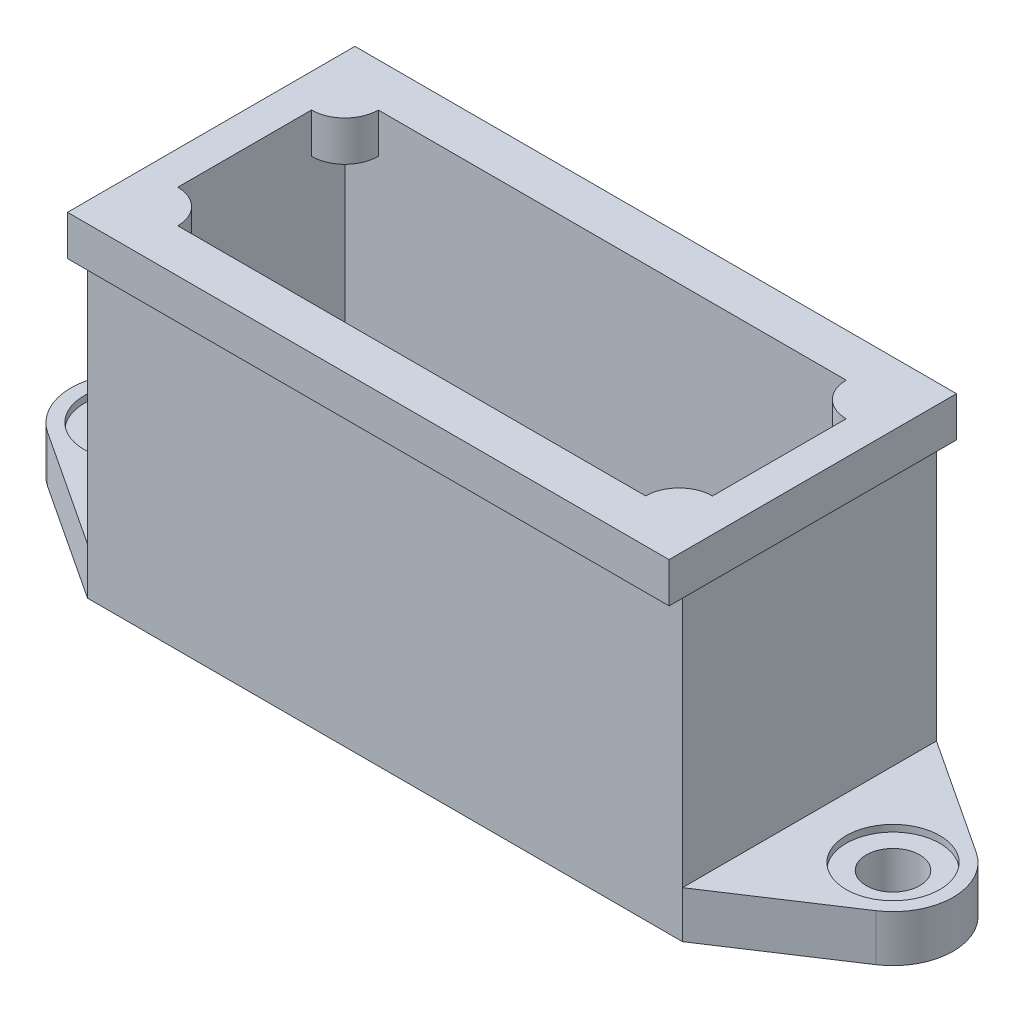
ISO-10303-21;
HEADER;
FILE_DESCRIPTION(('STEP AP214'),'2;1');
FILE_NAME('part.step','',(''),(''),'','','');
FILE_SCHEMA(('AUTOMOTIVE_DESIGN { 1 0 10303 214 1 1 1 1 }'));
ENDSEC;
DATA;
#1=APPLICATION_CONTEXT('core data for automotive mechanical design processes');
#2=APPLICATION_PROTOCOL_DEFINITION('international standard','automotive_design',2000,#1);
#3=PRODUCT_CONTEXT('',#1,'mechanical');
#4=PRODUCT('Part','Part','',(#3));
#5=PRODUCT_RELATED_PRODUCT_CATEGORY('part','',(#4));
#6=PRODUCT_DEFINITION_FORMATION('','',#4);
#7=PRODUCT_DEFINITION_CONTEXT('part definition',#1,'design');
#8=PRODUCT_DEFINITION('design','',#6,#7);
#9=PRODUCT_DEFINITION_SHAPE('','',#8);
#10=(LENGTH_UNIT() NAMED_UNIT(*) SI_UNIT(.MILLI.,.METRE.));
#11=(NAMED_UNIT(*) PLANE_ANGLE_UNIT() SI_UNIT($,.RADIAN.));
#12=(NAMED_UNIT(*) SI_UNIT($,.STERADIAN.) SOLID_ANGLE_UNIT());
#13=UNCERTAINTY_MEASURE_WITH_UNIT(LENGTH_MEASURE(1.E-05),#10,'distance_accuracy_value','');
#14=(GEOMETRIC_REPRESENTATION_CONTEXT(3) GLOBAL_UNCERTAINTY_ASSIGNED_CONTEXT((#13)) GLOBAL_UNIT_ASSIGNED_CONTEXT((#10,
#11,#12)) REPRESENTATION_CONTEXT('',''));
#15=CARTESIAN_POINT('',(0.,0.,0.));
#16=DIRECTION('',(0.,0.,1.));
#17=DIRECTION('',(1.,0.,0.));
#18=AXIS2_PLACEMENT_3D('',#15,#16,#17);
#19=CARTESIAN_POINT('',(89.,90.,38.));
#20=DIRECTION('',(-1.,0.,0.));
#21=DIRECTION('',(0.,0.,1.));
#22=AXIS2_PLACEMENT_3D('',#19,#20,#21);
#23=PLANE('',#22);
#24=DIRECTION('',(0.,0.,1.));
#25=VECTOR('',#24,1.);
#26=CARTESIAN_POINT('',(89.,14.,-38.));
#27=LINE('',#26,#25);
#28=CARTESIAN_POINT('',(89.,14.,-38.));
#29=VERTEX_POINT('',#28);
#30=CARTESIAN_POINT('',(89.,14.,38.));
#31=VERTEX_POINT('',#30);
#32=EDGE_CURVE('E57',#29,#31,#27,.T.);
#33=ORIENTED_EDGE('',*,*,#32,.F.);
#34=DIRECTION('',(0.,-1.,0.));
#35=VECTOR('',#34,1.);
#36=CARTESIAN_POINT('',(89.,90.,-38.));
#37=LINE('',#36,#35);
#38=CARTESIAN_POINT('',(89.,90.,-38.));
#39=VERTEX_POINT('',#38);
#40=EDGE_CURVE('E11',#39,#29,#37,.T.);
#41=ORIENTED_EDGE('',*,*,#40,.F.);
#42=DIRECTION('',(0.,0.,-1.));
#43=VECTOR('',#42,1.);
#44=CARTESIAN_POINT('',(89.,90.,38.));
#45=LINE('',#44,#43);
#46=CARTESIAN_POINT('',(89.,90.,38.));
#47=VERTEX_POINT('',#46);
#48=EDGE_CURVE('E363',#47,#39,#45,.T.);
#49=ORIENTED_EDGE('',*,*,#48,.F.);
#50=DIRECTION('',(0.,-1.,0.));
#51=VECTOR('',#50,1.);
#52=CARTESIAN_POINT('',(89.,90.,38.));
#53=LINE('',#52,#51);
#54=EDGE_CURVE('E376',#47,#31,#53,.T.);
#55=ORIENTED_EDGE('',*,*,#54,.T.);
#56=EDGE_LOOP('',(#33,#41,#49,#55));
#57=FACE_BOUND('',#56,.T.);
#58=ADVANCED_FACE('F35',(#57),#23,.F.);
#59=CARTESIAN_POINT('',(-89.,90.,-38.));
#60=DIRECTION('',(0.,0.,1.));
#61=DIRECTION('',(1.,0.,0.));
#62=AXIS2_PLACEMENT_3D('',#59,#60,#61);
#63=PLANE('',#62);
#64=DIRECTION('',(-1.,0.,0.));
#65=VECTOR('',#64,1.);
#66=CARTESIAN_POINT('',(-89.,0.,-38.));
#67=LINE('',#66,#65);
#68=CARTESIAN_POINT('',(89.,0.,-38.));
#69=VERTEX_POINT('',#68);
#70=CARTESIAN_POINT('',(-89.,0.,-38.));
#71=VERTEX_POINT('',#70);
#72=EDGE_CURVE('E362',#69,#71,#67,.T.);
#73=ORIENTED_EDGE('',*,*,#72,.T.);
#74=DIRECTION('',(0.,-1.,0.));
#75=VECTOR('',#74,1.);
#76=CARTESIAN_POINT('',(-89.,14.,-38.));
#77=LINE('',#76,#75);
#78=CARTESIAN_POINT('',(-89.,14.,-38.));
#79=VERTEX_POINT('',#78);
#80=EDGE_CURVE('E315',#79,#71,#77,.T.);
#81=ORIENTED_EDGE('',*,*,#80,.F.);
#82=DIRECTION('',(0.,-1.,0.));
#83=VECTOR('',#82,1.);
#84=CARTESIAN_POINT('',(-89.,90.,-38.));
#85=LINE('',#84,#83);
#86=CARTESIAN_POINT('',(-89.,90.,-38.));
#87=VERTEX_POINT('',#86);
#88=EDGE_CURVE('E42',#87,#79,#85,.T.);
#89=ORIENTED_EDGE('',*,*,#88,.F.);
#90=DIRECTION('',(-1.,0.,0.));
#91=VECTOR('',#90,1.);
#92=CARTESIAN_POINT('',(-89.,90.,-38.));
#93=LINE('',#92,#91);
#94=EDGE_CURVE('E366',#39,#87,#93,.T.);
#95=ORIENTED_EDGE('',*,*,#94,.F.);
#96=ORIENTED_EDGE('',*,*,#40,.T.);
#97=DIRECTION('',(0.,-1.,0.));
#98=VECTOR('',#97,1.);
#99=CARTESIAN_POINT('',(89.,14.,-38.));
#100=LINE('',#99,#98);
#101=EDGE_CURVE('E357',#29,#69,#100,.T.);
#102=ORIENTED_EDGE('',*,*,#101,.T.);
#103=EDGE_LOOP('',(#73,#81,#89,#95,#96,#102));
#104=FACE_BOUND('',#103,.T.);
#105=ADVANCED_FACE('F389',(#104),#63,.F.);
#106=CARTESIAN_POINT('',(-89.,90.,38.));
#107=DIRECTION('',(1.,0.,0.));
#108=DIRECTION('',(0.,0.,-1.));
#109=AXIS2_PLACEMENT_3D('',#106,#107,#108);
#110=PLANE('',#109);
#111=ORIENTED_EDGE('',*,*,#88,.T.);
#112=DIRECTION('',(0.,0.,1.));
#113=VECTOR('',#112,1.);
#114=CARTESIAN_POINT('',(-89.,14.,-38.));
#115=LINE('',#114,#113);
#116=CARTESIAN_POINT('',(-89.,14.,38.));
#117=VERTEX_POINT('',#116);
#118=EDGE_CURVE('E300',#79,#117,#115,.T.);
#119=ORIENTED_EDGE('',*,*,#118,.T.);
#120=DIRECTION('',(0.,-1.,0.));
#121=VECTOR('',#120,1.);
#122=CARTESIAN_POINT('',(-89.,90.,38.));
#123=LINE('',#122,#121);
#124=CARTESIAN_POINT('',(-89.,90.,38.));
#125=VERTEX_POINT('',#124);
#126=EDGE_CURVE('E381',#125,#117,#123,.T.);
#127=ORIENTED_EDGE('',*,*,#126,.F.);
#128=DIRECTION('',(0.,0.,1.));
#129=VECTOR('',#128,1.);
#130=CARTESIAN_POINT('',(-89.,90.,38.));
#131=LINE('',#130,#129);
#132=EDGE_CURVE('E370',#87,#125,#131,.T.);
#133=ORIENTED_EDGE('',*,*,#132,.F.);
#134=EDGE_LOOP('',(#111,#119,#127,#133));
#135=FACE_BOUND('',#134,.T.);
#136=ADVANCED_FACE('F386',(#135),#110,.F.);
#137=CARTESIAN_POINT('',(-89.,90.,38.));
#138=DIRECTION('',(0.,0.,-1.));
#139=DIRECTION('',(-1.,0.,0.));
#140=AXIS2_PLACEMENT_3D('',#137,#138,#139);
#141=PLANE('',#140);
#142=DIRECTION('',(1.,0.,0.));
#143=VECTOR('',#142,1.);
#144=CARTESIAN_POINT('',(-89.,0.,38.));
#145=LINE('',#144,#143);
#146=CARTESIAN_POINT('',(-89.,0.,38.));
#147=VERTEX_POINT('',#146);
#148=CARTESIAN_POINT('',(89.,0.,38.));
#149=VERTEX_POINT('',#148);
#150=EDGE_CURVE('E367',#147,#149,#145,.T.);
#151=ORIENTED_EDGE('',*,*,#150,.T.);
#152=DIRECTION('',(0.,-1.,0.));
#153=VECTOR('',#152,1.);
#154=CARTESIAN_POINT('',(89.,14.,38.));
#155=LINE('',#154,#153);
#156=EDGE_CURVE('E354',#31,#149,#155,.T.);
#157=ORIENTED_EDGE('',*,*,#156,.F.);
#158=ORIENTED_EDGE('',*,*,#54,.F.);
#159=DIRECTION('',(1.,0.,0.));
#160=VECTOR('',#159,1.);
#161=CARTESIAN_POINT('',(-89.,90.,38.));
#162=LINE('',#161,#160);
#163=EDGE_CURVE('E373',#125,#47,#162,.T.);
#164=ORIENTED_EDGE('',*,*,#163,.F.);
#165=ORIENTED_EDGE('',*,*,#126,.T.);
#166=DIRECTION('',(0.,-1.,0.));
#167=VECTOR('',#166,1.);
#168=CARTESIAN_POINT('',(-89.,14.,38.));
#169=LINE('',#168,#167);
#170=EDGE_CURVE('E317',#117,#147,#169,.T.);
#171=ORIENTED_EDGE('',*,*,#170,.T.);
#172=EDGE_LOOP('',(#151,#157,#158,#164,#165,#171));
#173=FACE_BOUND('',#172,.T.);
#174=ADVANCED_FACE('F423',(#173),#141,.F.);
#175=CARTESIAN_POINT('',(0.,0.,0.));
#176=DIRECTION('',(0.,-1.,0.));
#177=DIRECTION('',(0.,0.,-1.));
#178=AXIS2_PLACEMENT_3D('',#175,#176,#177);
#179=PLANE('',#178);
#180=CARTESIAN_POINT('',(-114.,0.,0.));
#181=DIRECTION('',(0.,1.,0.));
#182=DIRECTION('',(0.,0.,1.));
#183=AXIS2_PLACEMENT_3D('',#180,#181,#182);
#184=CIRCLE('',#183,7.99999999999999);
#185=CARTESIAN_POINT('',(-114.,0.,7.99999999999999));
#186=VERTEX_POINT('',#185);
#187=EDGE_CURVE('E291',#186,#186,#184,.T.);
#188=ORIENTED_EDGE('',*,*,#187,.T.);
#189=EDGE_LOOP('',(#188));
#190=FACE_BOUND('',#189,.T.);
#191=CARTESIAN_POINT('',(114.,0.,0.));
#192=DIRECTION('',(0.,1.,0.));
#193=DIRECTION('',(0.,0.,1.));
#194=AXIS2_PLACEMENT_3D('',#191,#192,#193);
#195=CIRCLE('',#194,7.99999999999999);
#196=CARTESIAN_POINT('',(114.,0.,7.99999999999999));
#197=VERTEX_POINT('',#196);
#198=EDGE_CURVE('E331',#197,#197,#195,.T.);
#199=ORIENTED_EDGE('',*,*,#198,.T.);
#200=EDGE_LOOP('',(#199));
#201=FACE_BOUND('',#200,.T.);
#202=ORIENTED_EDGE('',*,*,#72,.F.);
#203=DIRECTION('',(-0.835345543117579,0.,-0.54972522553872));
#204=VECTOR('',#203,1.);
#205=CARTESIAN_POINT('',(123.895054059697,0.,-15.0362197761164));
#206=LINE('',#205,#204);
#207=CARTESIAN_POINT('',(123.895054059697,0.,-15.0362197761164));
#208=VERTEX_POINT('',#207);
#209=EDGE_CURVE('E348',#208,#69,#206,.T.);
#210=ORIENTED_EDGE('',*,*,#209,.F.);
#211=CARTESIAN_POINT('',(114.,0.,0.));
#212=DIRECTION('',(0.,1.,0.));
#213=DIRECTION('',(0.,0.,1.));
#214=AXIS2_PLACEMENT_3D('',#211,#212,#213);
#215=CIRCLE('',#214,18.);
#216=CARTESIAN_POINT('',(123.895054059697,0.,15.0362197761164));
#217=VERTEX_POINT('',#216);
#218=EDGE_CURVE('E334',#217,#208,#215,.T.);
#219=ORIENTED_EDGE('',*,*,#218,.F.);
#220=DIRECTION('',(0.835345543117579,0.,-0.54972522553872));
#221=VECTOR('',#220,1.);
#222=CARTESIAN_POINT('',(123.895054059697,0.,15.0362197761164));
#223=LINE('',#222,#221);
#224=EDGE_CURVE('E339',#149,#217,#223,.T.);
#225=ORIENTED_EDGE('',*,*,#224,.F.);
#226=ORIENTED_EDGE('',*,*,#150,.F.);
#227=DIRECTION('',(-0.835345543117579,0.,-0.54972522553872));
#228=VECTOR('',#227,1.);
#229=CARTESIAN_POINT('',(-123.895054059697,0.,15.0362197761164));
#230=LINE('',#229,#228);
#231=CARTESIAN_POINT('',(-123.895054059697,0.,15.0362197761164));
#232=VERTEX_POINT('',#231);
#233=EDGE_CURVE('E309',#147,#232,#230,.T.);
#234=ORIENTED_EDGE('',*,*,#233,.T.);
#235=CARTESIAN_POINT('',(-114.,0.,0.));
#236=DIRECTION('',(0.,-1.,0.));
#237=DIRECTION('',(0.,0.,1.));
#238=AXIS2_PLACEMENT_3D('',#235,#236,#237);
#239=CIRCLE('',#238,18.);
#240=CARTESIAN_POINT('',(-123.895054059697,0.,-15.0362197761164));
#241=VERTEX_POINT('',#240);
#242=EDGE_CURVE('E294',#232,#241,#239,.T.);
#243=ORIENTED_EDGE('',*,*,#242,.T.);
#244=DIRECTION('',(0.835345543117579,0.,-0.54972522553872));
#245=VECTOR('',#244,1.);
#246=CARTESIAN_POINT('',(-123.895054059697,0.,-15.0362197761164));
#247=LINE('',#246,#245);
#248=EDGE_CURVE('E298',#241,#71,#247,.T.);
#249=ORIENTED_EDGE('',*,*,#248,.T.);
#250=EDGE_LOOP('',(#202,#210,#219,#225,#226,#234,#243,#249));
#251=FACE_BOUND('',#250,.T.);
#252=ADVANCED_FACE('F396',(#190,#201,#251),#179,.T.);
#253=CARTESIAN_POINT('',(114.,14.,0.));
#254=DIRECTION('',(0.,-1.,0.));
#255=DIRECTION('',(0.,0.,-1.));
#256=AXIS2_PLACEMENT_3D('',#253,#254,#255);
#257=CYLINDRICAL_SURFACE('',#256,18.);
#258=ORIENTED_EDGE('',*,*,#218,.T.);
#259=DIRECTION('',(0.,-1.,0.));
#260=VECTOR('',#259,1.);
#261=CARTESIAN_POINT('',(123.895054059697,14.,-15.0362197761164));
#262=LINE('',#261,#260);
#263=CARTESIAN_POINT('',(123.895054059697,14.,-15.0362197761164));
#264=VERTEX_POINT('',#263);
#265=EDGE_CURVE('E359',#264,#208,#262,.T.);
#266=ORIENTED_EDGE('',*,*,#265,.F.);
#267=CARTESIAN_POINT('',(114.,14.,0.));
#268=DIRECTION('',(0.,1.,0.));
#269=DIRECTION('',(0.,0.,1.));
#270=AXIS2_PLACEMENT_3D('',#267,#268,#269);
#271=CIRCLE('',#270,18.);
#272=CARTESIAN_POINT('',(123.895054059697,14.,15.0362197761164));
#273=VERTEX_POINT('',#272);
#274=EDGE_CURVE('E335',#273,#264,#271,.T.);
#275=ORIENTED_EDGE('',*,*,#274,.F.);
#276=DIRECTION('',(0.,-1.,0.));
#277=VECTOR('',#276,1.);
#278=CARTESIAN_POINT('',(123.895054059697,14.,15.0362197761164));
#279=LINE('',#278,#277);
#280=EDGE_CURVE('E345',#273,#217,#279,.T.);
#281=ORIENTED_EDGE('',*,*,#280,.T.);
#282=EDGE_LOOP('',(#258,#266,#275,#281));
#283=FACE_BOUND('',#282,.T.);
#284=ADVANCED_FACE('F431',(#283),#257,.T.);
#285=CARTESIAN_POINT('',(123.895054059697,14.,-15.0362197761164));
#286=DIRECTION('',(-0.54972522553872,0.,0.835345543117579));
#287=DIRECTION('',(0.835345543117579,0.,0.54972522553872));
#288=AXIS2_PLACEMENT_3D('',#285,#286,#287);
#289=PLANE('',#288);
#290=ORIENTED_EDGE('',*,*,#209,.T.);
#291=ORIENTED_EDGE('',*,*,#101,.F.);
#292=DIRECTION('',(-0.835345543117579,0.,-0.54972522553872));
#293=VECTOR('',#292,1.);
#294=CARTESIAN_POINT('',(123.895054059697,14.,-15.0362197761164));
#295=LINE('',#294,#293);
#296=EDGE_CURVE('E338',#264,#29,#295,.T.);
#297=ORIENTED_EDGE('',*,*,#296,.F.);
#298=ORIENTED_EDGE('',*,*,#265,.T.);
#299=EDGE_LOOP('',(#290,#291,#297,#298));
#300=FACE_BOUND('',#299,.T.);
#301=ADVANCED_FACE('F435',(#300),#289,.F.);
#302=CARTESIAN_POINT('',(123.895054059697,14.,15.0362197761164));
#303=DIRECTION('',(-0.54972522553872,0.,-0.835345543117579));
#304=DIRECTION('',(-0.835345543117579,0.,0.54972522553872));
#305=AXIS2_PLACEMENT_3D('',#302,#303,#304);
#306=PLANE('',#305);
#307=ORIENTED_EDGE('',*,*,#224,.T.);
#308=ORIENTED_EDGE('',*,*,#280,.F.);
#309=DIRECTION('',(0.835345543117579,0.,-0.54972522553872));
#310=VECTOR('',#309,1.);
#311=CARTESIAN_POINT('',(123.895054059697,14.,15.0362197761164));
#312=LINE('',#311,#310);
#313=EDGE_CURVE('E343',#31,#273,#312,.T.);
#314=ORIENTED_EDGE('',*,*,#313,.F.);
#315=ORIENTED_EDGE('',*,*,#156,.T.);
#316=EDGE_LOOP('',(#307,#308,#314,#315));
#317=FACE_BOUND('',#316,.T.);
#318=ADVANCED_FACE('F439',(#317),#306,.F.);
#319=CARTESIAN_POINT('',(114.,14.,0.));
#320=DIRECTION('',(0.,1.,0.));
#321=DIRECTION('',(0.,0.,1.));
#322=AXIS2_PLACEMENT_3D('',#319,#320,#321);
#323=PLANE('',#322);
#324=CARTESIAN_POINT('',(114.,14.,0.));
#325=DIRECTION('',(0.,1.,0.));
#326=DIRECTION('',(0.,0.,1.));
#327=AXIS2_PLACEMENT_3D('',#324,#325,#326);
#328=CIRCLE('',#327,14.);
#329=CARTESIAN_POINT('',(114.,14.,14.));
#330=VERTEX_POINT('',#329);
#331=EDGE_CURVE('E322',#330,#330,#328,.T.);
#332=ORIENTED_EDGE('',*,*,#331,.F.);
#333=EDGE_LOOP('',(#332));
#334=FACE_BOUND('',#333,.T.);
#335=ORIENTED_EDGE('',*,*,#274,.T.);
#336=ORIENTED_EDGE('',*,*,#296,.T.);
#337=ORIENTED_EDGE('',*,*,#32,.T.);
#338=ORIENTED_EDGE('',*,*,#313,.T.);
#339=EDGE_LOOP('',(#335,#336,#337,#338));
#340=FACE_BOUND('',#339,.T.);
#341=ADVANCED_FACE('F443',(#334,#340),#323,.T.);
#342=CARTESIAN_POINT('',(114.,14.,0.));
#343=DIRECTION('',(0.,1.,0.));
#344=DIRECTION('',(0.,0.,1.));
#345=AXIS2_PLACEMENT_3D('',#342,#343,#344);
#346=CYLINDRICAL_SURFACE('',#345,7.99999999999999);
#347=ORIENTED_EDGE('',*,*,#198,.F.);
#348=EDGE_LOOP('',(#347));
#349=FACE_BOUND('',#348,.T.);
#350=CARTESIAN_POINT('',(114.,12.,0.));
#351=DIRECTION('',(0.,1.,0.));
#352=DIRECTION('',(0.,0.,1.));
#353=AXIS2_PLACEMENT_3D('',#350,#351,#352);
#354=CIRCLE('',#353,7.99999999999999);
#355=CARTESIAN_POINT('',(114.,12.,7.99999999999999));
#356=VERTEX_POINT('',#355);
#357=EDGE_CURVE('E328',#356,#356,#354,.T.);
#358=ORIENTED_EDGE('',*,*,#357,.T.);
#359=EDGE_LOOP('',(#358));
#360=FACE_BOUND('',#359,.T.);
#361=ADVANCED_FACE('F447',(#349,#360),#346,.F.);
#362=CARTESIAN_POINT('',(122.,12.,0.));
#363=DIRECTION('',(0.,-1.,0.));
#364=DIRECTION('',(0.,0.,-1.));
#365=AXIS2_PLACEMENT_3D('',#362,#363,#364);
#366=PLANE('',#365);
#367=ORIENTED_EDGE('',*,*,#357,.F.);
#368=EDGE_LOOP('',(#367));
#369=FACE_BOUND('',#368,.T.);
#370=CARTESIAN_POINT('',(114.,12.,0.));
#371=DIRECTION('',(0.,1.,0.));
#372=DIRECTION('',(0.,0.,1.));
#373=AXIS2_PLACEMENT_3D('',#370,#371,#372);
#374=CIRCLE('',#373,14.);
#375=CARTESIAN_POINT('',(114.,12.,14.));
#376=VERTEX_POINT('',#375);
#377=EDGE_CURVE('E325',#376,#376,#374,.T.);
#378=ORIENTED_EDGE('',*,*,#377,.T.);
#379=EDGE_LOOP('',(#378));
#380=FACE_BOUND('',#379,.T.);
#381=ADVANCED_FACE('F451',(#369,#380),#366,.F.);
#382=CARTESIAN_POINT('',(114.,14.,0.));
#383=DIRECTION('',(0.,1.,0.));
#384=DIRECTION('',(0.,0.,1.));
#385=AXIS2_PLACEMENT_3D('',#382,#383,#384);
#386=CYLINDRICAL_SURFACE('',#385,14.);
#387=ORIENTED_EDGE('',*,*,#377,.F.);
#388=EDGE_LOOP('',(#387));
#389=FACE_BOUND('',#388,.T.);
#390=ORIENTED_EDGE('',*,*,#331,.T.);
#391=EDGE_LOOP('',(#390));
#392=FACE_BOUND('',#391,.T.);
#393=ADVANCED_FACE('F455',(#389,#392),#386,.F.);
#394=CARTESIAN_POINT('',(-114.,14.,0.));
#395=DIRECTION('',(0.,-1.,0.));
#396=DIRECTION('',(0.,0.,-1.));
#397=AXIS2_PLACEMENT_3D('',#394,#395,#396);
#398=CYLINDRICAL_SURFACE('',#397,18.);
#399=ORIENTED_EDGE('',*,*,#242,.F.);
#400=DIRECTION('',(0.,-1.,0.));
#401=VECTOR('',#400,1.);
#402=CARTESIAN_POINT('',(-123.895054059697,14.,15.0362197761164));
#403=LINE('',#402,#401);
#404=CARTESIAN_POINT('',(-123.895054059697,14.,15.0362197761164));
#405=VERTEX_POINT('',#404);
#406=EDGE_CURVE('E320',#405,#232,#403,.T.);
#407=ORIENTED_EDGE('',*,*,#406,.F.);
#408=CARTESIAN_POINT('',(-114.,14.,0.));
#409=DIRECTION('',(0.,-1.,0.));
#410=DIRECTION('',(0.,0.,1.));
#411=AXIS2_PLACEMENT_3D('',#408,#409,#410);
#412=CIRCLE('',#411,18.);
#413=CARTESIAN_POINT('',(-123.895054059697,14.,-15.0362197761164));
#414=VERTEX_POINT('',#413);
#415=EDGE_CURVE('E295',#405,#414,#412,.T.);
#416=ORIENTED_EDGE('',*,*,#415,.T.);
#417=DIRECTION('',(0.,-1.,0.));
#418=VECTOR('',#417,1.);
#419=CARTESIAN_POINT('',(-123.895054059697,14.,-15.0362197761164));
#420=LINE('',#419,#418);
#421=EDGE_CURVE('E306',#414,#241,#420,.T.);
#422=ORIENTED_EDGE('',*,*,#421,.T.);
#423=EDGE_LOOP('',(#399,#407,#416,#422));
#424=FACE_BOUND('',#423,.T.);
#425=ADVANCED_FACE('F400',(#424),#398,.T.);
#426=CARTESIAN_POINT('',(-123.895054059697,14.,15.0362197761164));
#427=DIRECTION('',(-0.54972522553872,0.,0.835345543117579));
#428=DIRECTION('',(0.835345543117579,0.,0.54972522553872));
#429=AXIS2_PLACEMENT_3D('',#426,#427,#428);
#430=PLANE('',#429);
#431=ORIENTED_EDGE('',*,*,#233,.F.);
#432=ORIENTED_EDGE('',*,*,#170,.F.);
#433=DIRECTION('',(-0.835345543117579,0.,-0.54972522553872));
#434=VECTOR('',#433,1.);
#435=CARTESIAN_POINT('',(-123.895054059697,14.,15.0362197761164));
#436=LINE('',#435,#434);
#437=EDGE_CURVE('E49',#117,#405,#436,.T.);
#438=ORIENTED_EDGE('',*,*,#437,.T.);
#439=ORIENTED_EDGE('',*,*,#406,.T.);
#440=EDGE_LOOP('',(#431,#432,#438,#439));
#441=FACE_BOUND('',#440,.T.);
#442=ADVANCED_FACE('F413',(#441),#430,.T.);
#443=CARTESIAN_POINT('',(-123.895054059697,14.,-15.0362197761164));
#444=DIRECTION('',(-0.54972522553872,0.,-0.835345543117579));
#445=DIRECTION('',(-0.835345543117579,0.,0.54972522553872));
#446=AXIS2_PLACEMENT_3D('',#443,#444,#445);
#447=PLANE('',#446);
#448=ORIENTED_EDGE('',*,*,#248,.F.);
#449=ORIENTED_EDGE('',*,*,#421,.F.);
#450=DIRECTION('',(0.835345543117579,0.,-0.54972522553872));
#451=VECTOR('',#450,1.);
#452=CARTESIAN_POINT('',(-123.895054059697,14.,-15.0362197761164));
#453=LINE('',#452,#451);
#454=EDGE_CURVE('E303',#414,#79,#453,.T.);
#455=ORIENTED_EDGE('',*,*,#454,.T.);
#456=ORIENTED_EDGE('',*,*,#80,.T.);
#457=EDGE_LOOP('',(#448,#449,#455,#456));
#458=FACE_BOUND('',#457,.T.);
#459=ADVANCED_FACE('F393',(#458),#447,.T.);
#460=CARTESIAN_POINT('',(-114.,14.,0.));
#461=DIRECTION('',(0.,1.,0.));
#462=DIRECTION('',(0.,0.,1.));
#463=AXIS2_PLACEMENT_3D('',#460,#461,#462);
#464=PLANE('',#463);
#465=CARTESIAN_POINT('',(-114.,14.,0.));
#466=DIRECTION('',(0.,1.,0.));
#467=DIRECTION('',(0.,0.,1.));
#468=AXIS2_PLACEMENT_3D('',#465,#466,#467);
#469=CIRCLE('',#468,14.);
#470=CARTESIAN_POINT('',(-114.,14.,14.));
#471=VERTEX_POINT('',#470);
#472=EDGE_CURVE('E274',#471,#471,#469,.T.);
#473=ORIENTED_EDGE('',*,*,#472,.F.);
#474=EDGE_LOOP('',(#473));
#475=FACE_BOUND('',#474,.T.);
#476=ORIENTED_EDGE('',*,*,#415,.F.);
#477=ORIENTED_EDGE('',*,*,#437,.F.);
#478=ORIENTED_EDGE('',*,*,#118,.F.);
#479=ORIENTED_EDGE('',*,*,#454,.F.);
#480=EDGE_LOOP('',(#476,#477,#478,#479));
#481=FACE_BOUND('',#480,.T.);
#482=ADVANCED_FACE('F401',(#475,#481),#464,.T.);
#483=CARTESIAN_POINT('',(-114.,14.,0.));
#484=DIRECTION('',(0.,1.,0.));
#485=DIRECTION('',(0.,0.,1.));
#486=AXIS2_PLACEMENT_3D('',#483,#484,#485);
#487=CYLINDRICAL_SURFACE('',#486,7.99999999999999);
#488=ORIENTED_EDGE('',*,*,#187,.F.);
#489=EDGE_LOOP('',(#488));
#490=FACE_BOUND('',#489,.T.);
#491=CARTESIAN_POINT('',(-114.,12.,0.));
#492=DIRECTION('',(0.,1.,0.));
#493=DIRECTION('',(0.,0.,1.));
#494=AXIS2_PLACEMENT_3D('',#491,#492,#493);
#495=CIRCLE('',#494,7.99999999999999);
#496=CARTESIAN_POINT('',(-114.,12.,7.99999999999999));
#497=VERTEX_POINT('',#496);
#498=EDGE_CURVE('E288',#497,#497,#495,.T.);
#499=ORIENTED_EDGE('',*,*,#498,.T.);
#500=EDGE_LOOP('',(#499));
#501=FACE_BOUND('',#500,.T.);
#502=ADVANCED_FACE('F403',(#490,#501),#487,.F.);
#503=CARTESIAN_POINT('',(-106.,12.,0.));
#504=DIRECTION('',(0.,-1.,0.));
#505=DIRECTION('',(0.,0.,-1.));
#506=AXIS2_PLACEMENT_3D('',#503,#504,#505);
#507=PLANE('',#506);
#508=ORIENTED_EDGE('',*,*,#498,.F.);
#509=EDGE_LOOP('',(#508));
#510=FACE_BOUND('',#509,.T.);
#511=CARTESIAN_POINT('',(-114.,12.,0.));
#512=DIRECTION('',(0.,1.,0.));
#513=DIRECTION('',(0.,0.,1.));
#514=AXIS2_PLACEMENT_3D('',#511,#512,#513);
#515=CIRCLE('',#514,14.);
#516=CARTESIAN_POINT('',(-114.,12.,14.));
#517=VERTEX_POINT('',#516);
#518=EDGE_CURVE('E285',#517,#517,#515,.T.);
#519=ORIENTED_EDGE('',*,*,#518,.T.);
#520=EDGE_LOOP('',(#519));
#521=FACE_BOUND('',#520,.T.);
#522=ADVANCED_FACE('F410',(#510,#521),#507,.F.);
#523=CARTESIAN_POINT('',(-114.,14.,0.));
#524=DIRECTION('',(0.,1.,0.));
#525=DIRECTION('',(0.,0.,1.));
#526=AXIS2_PLACEMENT_3D('',#523,#524,#525);
#527=CYLINDRICAL_SURFACE('',#526,14.);
#528=ORIENTED_EDGE('',*,*,#518,.F.);
#529=EDGE_LOOP('',(#528));
#530=FACE_BOUND('',#529,.T.);
#531=ORIENTED_EDGE('',*,*,#472,.T.);
#532=EDGE_LOOP('',(#531));
#533=FACE_BOUND('',#532,.T.);
#534=ADVANCED_FACE('F597',(#530,#533),#527,.F.);
#535=CARTESIAN_POINT('',(0.,90.,0.));
#536=DIRECTION('',(0.,1.,0.));
#537=DIRECTION('',(0.,0.,1.));
#538=AXIS2_PLACEMENT_3D('',#535,#536,#537);
#539=PLANE('',#538);
#540=DIRECTION('',(-1.,0.,0.));
#541=VECTOR('',#540,1.);
#542=CARTESIAN_POINT('',(-80.,90.,-30.));
#543=LINE('',#542,#541);
#544=CARTESIAN_POINT('',(80.,90.,-30.));
#545=VERTEX_POINT('',#544);
#546=CARTESIAN_POINT('',(69.9999999999999,90.,-30.));
#547=VERTEX_POINT('',#546);
#548=EDGE_CURVE('E262',#545,#547,#543,.T.);
#549=ORIENTED_EDGE('',*,*,#548,.F.);
#550=DIRECTION('',(0.,0.,-1.));
#551=VECTOR('',#550,1.);
#552=CARTESIAN_POINT('',(80.,90.,30.));
#553=LINE('',#552,#551);
#554=CARTESIAN_POINT('',(80.,90.,-20.0000000000007));
#555=VERTEX_POINT('',#554);
#556=EDGE_CURVE('E261',#555,#545,#553,.T.);
#557=ORIENTED_EDGE('',*,*,#556,.F.);
#558=CARTESIAN_POINT('',(79.9999999999999,90.,-30.0000000000007));
#559=DIRECTION('',(0.,1.,0.));
#560=DIRECTION('',(0.,0.,1.));
#561=AXIS2_PLACEMENT_3D('',#558,#559,#560);
#562=CIRCLE('',#561,10.);
#563=EDGE_CURVE('E539',#555,#547,#562,.F.);
#564=ORIENTED_EDGE('',*,*,#563,.T.);
#565=EDGE_LOOP('',(#549,#557,#564));
#566=FACE_BOUND('',#565,.T.);
#567=ADVANCED_FACE('F483',(#566),#539,.F.);
#568=CARTESIAN_POINT('',(80.,90.,30.));
#569=VERTEX_POINT('',#568);
#570=CARTESIAN_POINT('',(80.,90.,20.));
#571=VERTEX_POINT('',#570);
#572=EDGE_CURVE('E257',#569,#571,#553,.T.);
#573=ORIENTED_EDGE('',*,*,#572,.F.);
#574=DIRECTION('',(1.,0.,0.));
#575=VECTOR('',#574,1.);
#576=CARTESIAN_POINT('',(-80.,90.,30.));
#577=LINE('',#576,#575);
#578=CARTESIAN_POINT('',(69.9999999999999,90.,30.));
#579=VERTEX_POINT('',#578);
#580=EDGE_CURVE('E268',#579,#569,#577,.T.);
#581=ORIENTED_EDGE('',*,*,#580,.F.);
#582=CARTESIAN_POINT('',(79.9999999999999,90.,30.));
#583=DIRECTION('',(0.,1.,0.));
#584=DIRECTION('',(0.,0.,1.));
#585=AXIS2_PLACEMENT_3D('',#582,#583,#584);
#586=CIRCLE('',#585,10.);
#587=EDGE_CURVE('E496',#579,#571,#586,.F.);
#588=ORIENTED_EDGE('',*,*,#587,.T.);
#589=EDGE_LOOP('',(#573,#581,#588));
#590=FACE_BOUND('',#589,.T.);
#591=ADVANCED_FACE('F596',(#590),#539,.F.);
#592=CARTESIAN_POINT('',(-70.,90.,-30.));
#593=VERTEX_POINT('',#592);
#594=CARTESIAN_POINT('',(-80.,90.,-30.));
#595=VERTEX_POINT('',#594);
#596=EDGE_CURVE('E260',#593,#595,#543,.T.);
#597=ORIENTED_EDGE('',*,*,#596,.F.);
#598=CARTESIAN_POINT('',(-80.,90.,-30.));
#599=DIRECTION('',(0.,1.,0.));
#600=DIRECTION('',(0.,0.,1.));
#601=AXIS2_PLACEMENT_3D('',#598,#599,#600);
#602=CIRCLE('',#601,9.99999999999962);
#603=CARTESIAN_POINT('',(-80.,90.,-20.0000000000007));
#604=VERTEX_POINT('',#603);
#605=EDGE_CURVE('E537',#604,#593,#602,.T.);
#606=ORIENTED_EDGE('',*,*,#605,.F.);
#607=DIRECTION('',(0.,0.,1.));
#608=VECTOR('',#607,1.);
#609=CARTESIAN_POINT('',(-80.,90.,30.));
#610=LINE('',#609,#608);
#611=EDGE_CURVE('E266',#595,#604,#610,.T.);
#612=ORIENTED_EDGE('',*,*,#611,.F.);
#613=EDGE_LOOP('',(#597,#606,#612));
#614=FACE_BOUND('',#613,.T.);
#615=ADVANCED_FACE('F602',(#614),#539,.F.);
#616=CARTESIAN_POINT('',(-80.,90.,30.));
#617=VERTEX_POINT('',#616);
#618=CARTESIAN_POINT('',(-70.,90.,30.));
#619=VERTEX_POINT('',#618);
#620=EDGE_CURVE('E247',#617,#619,#577,.T.);
#621=ORIENTED_EDGE('',*,*,#620,.F.);
#622=CARTESIAN_POINT('',(-80.,90.,20.));
#623=VERTEX_POINT('',#622);
#624=EDGE_CURVE('E265',#623,#617,#610,.T.);
#625=ORIENTED_EDGE('',*,*,#624,.F.);
#626=CARTESIAN_POINT('',(-79.9999999999997,90.,30.0000000000007));
#627=DIRECTION('',(0.,1.,0.));
#628=DIRECTION('',(0.,0.,1.));
#629=AXIS2_PLACEMENT_3D('',#626,#627,#628);
#630=CIRCLE('',#629,10.0000000000002);
#631=EDGE_CURVE('E234',#619,#623,#630,.T.);
#632=ORIENTED_EDGE('',*,*,#631,.F.);
#633=EDGE_LOOP('',(#621,#625,#632));
#634=FACE_BOUND('',#633,.T.);
#635=ADVANCED_FACE('F484',(#634),#539,.F.);
#636=CARTESIAN_POINT('',(0.,102.,43.));
#637=DIRECTION('',(0.,0.,-1.));
#638=DIRECTION('',(-1.,0.,0.));
#639=AXIS2_PLACEMENT_3D('',#636,#637,#638);
#640=PLANE('',#639);
#641=DIRECTION('',(1.,0.,0.));
#642=VECTOR('',#641,1.);
#643=CARTESIAN_POINT('',(0.,90.,43.));
#644=LINE('',#643,#642);
#645=CARTESIAN_POINT('',(-90.,90.,43.));
#646=VERTEX_POINT('',#645);
#647=CARTESIAN_POINT('',(90.,90.,43.));
#648=VERTEX_POINT('',#647);
#649=EDGE_CURVE('E488',#646,#648,#644,.T.);
#650=ORIENTED_EDGE('',*,*,#649,.T.);
#651=DIRECTION('',(0.,-1.,0.));
#652=VECTOR('',#651,1.);
#653=CARTESIAN_POINT('',(90.,102.,43.));
#654=LINE('',#653,#652);
#655=CARTESIAN_POINT('',(90.,102.,43.));
#656=VERTEX_POINT('',#655);
#657=EDGE_CURVE('E511',#656,#648,#654,.T.);
#658=ORIENTED_EDGE('',*,*,#657,.F.);
#659=DIRECTION('',(1.,0.,0.));
#660=VECTOR('',#659,1.);
#661=CARTESIAN_POINT('',(0.,102.,43.));
#662=LINE('',#661,#660);
#663=CARTESIAN_POINT('',(-90.,102.,43.));
#664=VERTEX_POINT('',#663);
#665=EDGE_CURVE('E558',#664,#656,#662,.T.);
#666=ORIENTED_EDGE('',*,*,#665,.F.);
#667=DIRECTION('',(0.,-1.,0.));
#668=VECTOR('',#667,1.);
#669=CARTESIAN_POINT('',(-90.,102.,43.));
#670=LINE('',#669,#668);
#671=EDGE_CURVE('E235',#664,#646,#670,.T.);
#672=ORIENTED_EDGE('',*,*,#671,.T.);
#673=EDGE_LOOP('',(#650,#658,#666,#672));
#674=FACE_BOUND('',#673,.T.);
#675=ADVANCED_FACE('F614',(#674),#640,.F.);
#676=CARTESIAN_POINT('',(90.,102.,0.));
#677=DIRECTION('',(-1.,0.,0.));
#678=DIRECTION('',(0.,0.,1.));
#679=AXIS2_PLACEMENT_3D('',#676,#677,#678);
#680=PLANE('',#679);
#681=DIRECTION('',(0.,0.,-1.));
#682=VECTOR('',#681,1.);
#683=CARTESIAN_POINT('',(90.,90.,0.));
#684=LINE('',#683,#682);
#685=CARTESIAN_POINT('',(90.,90.,-43.));
#686=VERTEX_POINT('',#685);
#687=EDGE_CURVE('E492',#648,#686,#684,.T.);
#688=ORIENTED_EDGE('',*,*,#687,.T.);
#689=DIRECTION('',(0.,-1.,0.));
#690=VECTOR('',#689,1.);
#691=CARTESIAN_POINT('',(90.,102.,-43.));
#692=LINE('',#691,#690);
#693=CARTESIAN_POINT('',(90.,102.,-43.));
#694=VERTEX_POINT('',#693);
#695=EDGE_CURVE('E509',#694,#686,#692,.T.);
#696=ORIENTED_EDGE('',*,*,#695,.F.);
#697=DIRECTION('',(0.,0.,-1.));
#698=VECTOR('',#697,1.);
#699=CARTESIAN_POINT('',(90.,102.,0.));
#700=LINE('',#699,#698);
#701=EDGE_CURVE('E556',#656,#694,#700,.T.);
#702=ORIENTED_EDGE('',*,*,#701,.F.);
#703=ORIENTED_EDGE('',*,*,#657,.T.);
#704=EDGE_LOOP('',(#688,#696,#702,#703));
#705=FACE_BOUND('',#704,.T.);
#706=ADVANCED_FACE('F549',(#705),#680,.F.);
#707=CARTESIAN_POINT('',(0.,102.,-43.));
#708=DIRECTION('',(0.,0.,-1.));
#709=DIRECTION('',(-1.,0.,0.));
#710=AXIS2_PLACEMENT_3D('',#707,#708,#709);
#711=PLANE('',#710);
#712=DIRECTION('',(1.,0.,0.));
#713=VECTOR('',#712,1.);
#714=CARTESIAN_POINT('',(0.,90.,-43.));
#715=LINE('',#714,#713);
#716=CARTESIAN_POINT('',(-90.,90.,-43.));
#717=VERTEX_POINT('',#716);
#718=EDGE_CURVE('E503',#717,#686,#715,.T.);
#719=ORIENTED_EDGE('',*,*,#718,.F.);
#720=DIRECTION('',(0.,-1.,0.));
#721=VECTOR('',#720,1.);
#722=CARTESIAN_POINT('',(-90.,102.,-43.));
#723=LINE('',#722,#721);
#724=CARTESIAN_POINT('',(-90.,102.,-43.));
#725=VERTEX_POINT('',#724);
#726=EDGE_CURVE('E237',#725,#717,#723,.T.);
#727=ORIENTED_EDGE('',*,*,#726,.F.);
#728=DIRECTION('',(1.,0.,0.));
#729=VECTOR('',#728,1.);
#730=CARTESIAN_POINT('',(0.,102.,-43.));
#731=LINE('',#730,#729);
#732=EDGE_CURVE('E554',#725,#694,#731,.T.);
#733=ORIENTED_EDGE('',*,*,#732,.T.);
#734=ORIENTED_EDGE('',*,*,#695,.T.);
#735=EDGE_LOOP('',(#719,#727,#733,#734));
#736=FACE_BOUND('',#735,.T.);
#737=ADVANCED_FACE('F552',(#736),#711,.T.);
#738=CARTESIAN_POINT('',(-79.9999999999997,102.,30.0000000000007));
#739=DIRECTION('',(0.,-1.,0.));
#740=DIRECTION('',(0.,0.,-1.));
#741=AXIS2_PLACEMENT_3D('',#738,#739,#740);
#742=CYLINDRICAL_SURFACE('',#741,10.0000000000002);
#743=ORIENTED_EDGE('',*,*,#631,.T.);
#744=DIRECTION('',(0.,-1.,0.));
#745=VECTOR('',#744,1.);
#746=CARTESIAN_POINT('',(-80.,102.,20.));
#747=LINE('',#746,#745);
#748=CARTESIAN_POINT('',(-80.,102.,20.));
#749=VERTEX_POINT('',#748);
#750=EDGE_CURVE('E214',#749,#623,#747,.T.);
#751=ORIENTED_EDGE('',*,*,#750,.F.);
#752=CARTESIAN_POINT('',(-79.9999999999997,102.,30.0000000000007));
#753=DIRECTION('',(0.,1.,0.));
#754=DIRECTION('',(0.,0.,1.));
#755=AXIS2_PLACEMENT_3D('',#752,#753,#754);
#756=CIRCLE('',#755,10.0000000000002);
#757=CARTESIAN_POINT('',(-70.,102.,30.));
#758=VERTEX_POINT('',#757);
#759=EDGE_CURVE('E220',#758,#749,#756,.T.);
#760=ORIENTED_EDGE('',*,*,#759,.F.);
#761=DIRECTION('',(0.,-1.,0.));
#762=VECTOR('',#761,1.);
#763=CARTESIAN_POINT('',(-70.,102.,30.));
#764=LINE('',#763,#762);
#765=EDGE_CURVE('E513',#758,#619,#764,.T.);
#766=ORIENTED_EDGE('',*,*,#765,.T.);
#767=EDGE_LOOP('',(#743,#751,#760,#766));
#768=FACE_BOUND('',#767,.T.);
#769=ADVANCED_FACE('F232',(#768),#742,.T.);
#770=CARTESIAN_POINT('',(-80.,102.,-30.));
#771=DIRECTION('',(0.,-1.,0.));
#772=DIRECTION('',(0.,0.,-1.));
#773=AXIS2_PLACEMENT_3D('',#770,#771,#772);
#774=CYLINDRICAL_SURFACE('',#773,9.99999999999962);
#775=ORIENTED_EDGE('',*,*,#605,.T.);
#776=DIRECTION('',(0.,-1.,0.));
#777=VECTOR('',#776,1.);
#778=CARTESIAN_POINT('',(-70.,102.,-30.));
#779=LINE('',#778,#777);
#780=CARTESIAN_POINT('',(-70.,102.,-30.));
#781=VERTEX_POINT('',#780);
#782=EDGE_CURVE('E239',#781,#593,#779,.T.);
#783=ORIENTED_EDGE('',*,*,#782,.F.);
#784=CARTESIAN_POINT('',(-80.,102.,-30.));
#785=DIRECTION('',(0.,1.,0.));
#786=DIRECTION('',(0.,0.,1.));
#787=AXIS2_PLACEMENT_3D('',#784,#785,#786);
#788=CIRCLE('',#787,9.99999999999962);
#789=CARTESIAN_POINT('',(-80.,102.,-20.0000000000007));
#790=VERTEX_POINT('',#789);
#791=EDGE_CURVE('E219',#790,#781,#788,.T.);
#792=ORIENTED_EDGE('',*,*,#791,.F.);
#793=DIRECTION('',(0.,-1.,0.));
#794=VECTOR('',#793,1.);
#795=CARTESIAN_POINT('',(-80.,102.,-20.0000000000007));
#796=LINE('',#795,#794);
#797=EDGE_CURVE('E216',#790,#604,#796,.T.);
#798=ORIENTED_EDGE('',*,*,#797,.T.);
#799=EDGE_LOOP('',(#775,#783,#792,#798));
#800=FACE_BOUND('',#799,.T.);
#801=ADVANCED_FACE('F535',(#800),#774,.T.);
#802=CARTESIAN_POINT('',(79.9999999999999,102.,-30.0000000000007));
#803=DIRECTION('',(0.,-1.,0.));
#804=DIRECTION('',(0.,0.,-1.));
#805=AXIS2_PLACEMENT_3D('',#802,#803,#804);
#806=CYLINDRICAL_SURFACE('',#805,10.);
#807=ORIENTED_EDGE('',*,*,#563,.F.);
#808=DIRECTION('',(0.,-1.,0.));
#809=VECTOR('',#808,1.);
#810=CARTESIAN_POINT('',(80.,102.,-20.0000000000007));
#811=LINE('',#810,#809);
#812=CARTESIAN_POINT('',(80.,102.,-20.0000000000007));
#813=VERTEX_POINT('',#812);
#814=EDGE_CURVE('E521',#813,#555,#811,.T.);
#815=ORIENTED_EDGE('',*,*,#814,.F.);
#816=CARTESIAN_POINT('',(79.9999999999999,102.,-30.0000000000007));
#817=DIRECTION('',(0.,1.,0.));
#818=DIRECTION('',(0.,0.,1.));
#819=AXIS2_PLACEMENT_3D('',#816,#817,#818);
#820=CIRCLE('',#819,10.);
#821=CARTESIAN_POINT('',(69.9999999999999,102.,-30.));
#822=VERTEX_POINT('',#821);
#823=EDGE_CURVE('E569',#813,#822,#820,.F.);
#824=ORIENTED_EDGE('',*,*,#823,.T.);
#825=DIRECTION('',(0.,-1.,0.));
#826=VECTOR('',#825,1.);
#827=CARTESIAN_POINT('',(69.9999999999999,102.,-30.));
#828=LINE('',#827,#826);
#829=EDGE_CURVE('E524',#822,#547,#828,.T.);
#830=ORIENTED_EDGE('',*,*,#829,.T.);
#831=EDGE_LOOP('',(#807,#815,#824,#830));
#832=FACE_BOUND('',#831,.T.);
#833=ADVANCED_FACE('F576',(#832),#806,.T.);
#834=CARTESIAN_POINT('',(79.9999999999999,102.,30.));
#835=DIRECTION('',(0.,-1.,0.));
#836=DIRECTION('',(0.,0.,-1.));
#837=AXIS2_PLACEMENT_3D('',#834,#835,#836);
#838=CYLINDRICAL_SURFACE('',#837,10.);
#839=ORIENTED_EDGE('',*,*,#587,.F.);
#840=DIRECTION('',(0.,-1.,0.));
#841=VECTOR('',#840,1.);
#842=CARTESIAN_POINT('',(69.9999999999999,102.,30.));
#843=LINE('',#842,#841);
#844=CARTESIAN_POINT('',(69.9999999999999,102.,30.));
#845=VERTEX_POINT('',#844);
#846=EDGE_CURVE('E515',#845,#579,#843,.T.);
#847=ORIENTED_EDGE('',*,*,#846,.F.);
#848=CARTESIAN_POINT('',(79.9999999999999,102.,30.));
#849=DIRECTION('',(0.,1.,0.));
#850=DIRECTION('',(0.,0.,1.));
#851=AXIS2_PLACEMENT_3D('',#848,#849,#850);
#852=CIRCLE('',#851,10.);
#853=CARTESIAN_POINT('',(80.,102.,20.));
#854=VERTEX_POINT('',#853);
#855=EDGE_CURVE('E564',#845,#854,#852,.F.);
#856=ORIENTED_EDGE('',*,*,#855,.T.);
#857=DIRECTION('',(0.,-1.,0.));
#858=VECTOR('',#857,1.);
#859=CARTESIAN_POINT('',(80.,102.,20.));
#860=LINE('',#859,#858);
#861=EDGE_CURVE('E519',#854,#571,#860,.T.);
#862=ORIENTED_EDGE('',*,*,#861,.T.);
#863=EDGE_LOOP('',(#839,#847,#856,#862));
#864=FACE_BOUND('',#863,.T.);
#865=ADVANCED_FACE('F584',(#864),#838,.T.);
#866=CARTESIAN_POINT('',(-90.,102.,0.));
#867=DIRECTION('',(-1.,0.,0.));
#868=DIRECTION('',(0.,0.,1.));
#869=AXIS2_PLACEMENT_3D('',#866,#867,#868);
#870=PLANE('',#869);
#871=DIRECTION('',(0.,0.,-1.));
#872=VECTOR('',#871,1.);
#873=CARTESIAN_POINT('',(-90.,90.,0.));
#874=LINE('',#873,#872);
#875=EDGE_CURVE('E230',#646,#717,#874,.T.);
#876=ORIENTED_EDGE('',*,*,#875,.F.);
#877=ORIENTED_EDGE('',*,*,#671,.F.);
#878=DIRECTION('',(0.,0.,-1.));
#879=VECTOR('',#878,1.);
#880=CARTESIAN_POINT('',(-90.,102.,0.));
#881=LINE('',#880,#879);
#882=EDGE_CURVE('E516',#664,#725,#881,.T.);
#883=ORIENTED_EDGE('',*,*,#882,.T.);
#884=ORIENTED_EDGE('',*,*,#726,.T.);
#885=EDGE_LOOP('',(#876,#877,#883,#884));
#886=FACE_BOUND('',#885,.T.);
#887=ADVANCED_FACE('F499',(#886),#870,.T.);
#888=CARTESIAN_POINT('',(0.,102.,0.));
#889=DIRECTION('',(0.,1.,0.));
#890=DIRECTION('',(0.,0.,1.));
#891=AXIS2_PLACEMENT_3D('',#888,#889,#890);
#892=PLANE('',#891);
#893=ORIENTED_EDGE('',*,*,#759,.T.);
#894=DIRECTION('',(0.,0.,-1.));
#895=VECTOR('',#894,1.);
#896=CARTESIAN_POINT('',(-80.,102.,0.));
#897=LINE('',#896,#895);
#898=EDGE_CURVE('E208',#749,#790,#897,.T.);
#899=ORIENTED_EDGE('',*,*,#898,.T.);
#900=ORIENTED_EDGE('',*,*,#791,.T.);
#901=DIRECTION('',(1.,0.,0.));
#902=VECTOR('',#901,1.);
#903=CARTESIAN_POINT('',(0.,102.,-30.));
#904=LINE('',#903,#902);
#905=EDGE_CURVE('E532',#781,#822,#904,.T.);
#906=ORIENTED_EDGE('',*,*,#905,.T.);
#907=ORIENTED_EDGE('',*,*,#823,.F.);
#908=DIRECTION('',(0.,0.,1.));
#909=VECTOR('',#908,1.);
#910=CARTESIAN_POINT('',(80.,102.,0.));
#911=LINE('',#910,#909);
#912=EDGE_CURVE('E567',#813,#854,#911,.T.);
#913=ORIENTED_EDGE('',*,*,#912,.T.);
#914=ORIENTED_EDGE('',*,*,#855,.F.);
#915=DIRECTION('',(-1.,0.,0.));
#916=VECTOR('',#915,1.);
#917=CARTESIAN_POINT('',(0.,102.,30.));
#918=LINE('',#917,#916);
#919=EDGE_CURVE('E227',#845,#758,#918,.T.);
#920=ORIENTED_EDGE('',*,*,#919,.T.);
#921=EDGE_LOOP('',(#893,#899,#900,#906,#907,#913,#914,#920));
#922=FACE_BOUND('',#921,.T.);
#923=ORIENTED_EDGE('',*,*,#665,.T.);
#924=ORIENTED_EDGE('',*,*,#701,.T.);
#925=ORIENTED_EDGE('',*,*,#732,.F.);
#926=ORIENTED_EDGE('',*,*,#882,.F.);
#927=EDGE_LOOP('',(#923,#924,#925,#926));
#928=FACE_BOUND('',#927,.T.);
#929=ADVANCED_FACE('F223',(#922,#928),#892,.T.);
#930=ORIENTED_EDGE('',*,*,#163,.T.);
#931=ORIENTED_EDGE('',*,*,#48,.T.);
#932=ORIENTED_EDGE('',*,*,#94,.T.);
#933=ORIENTED_EDGE('',*,*,#132,.T.);
#934=EDGE_LOOP('',(#930,#931,#932,#933));
#935=FACE_BOUND('',#934,.T.);
#936=ORIENTED_EDGE('',*,*,#649,.F.);
#937=ORIENTED_EDGE('',*,*,#875,.T.);
#938=ORIENTED_EDGE('',*,*,#718,.T.);
#939=ORIENTED_EDGE('',*,*,#687,.F.);
#940=EDGE_LOOP('',(#936,#937,#938,#939));
#941=FACE_BOUND('',#940,.T.);
#942=ADVANCED_FACE('F478',(#935,#941),#539,.F.);
#943=CARTESIAN_POINT('',(0.,27.,0.));
#944=DIRECTION('',(0.,-1.,0.));
#945=DIRECTION('',(0.,0.,-1.));
#946=AXIS2_PLACEMENT_3D('',#943,#944,#945);
#947=PLANE('',#946);
#948=DIRECTION('',(0.,0.,-1.));
#949=VECTOR('',#948,1.);
#950=CARTESIAN_POINT('',(80.,27.,30.));
#951=LINE('',#950,#949);
#952=CARTESIAN_POINT('',(80.,27.,30.));
#953=VERTEX_POINT('',#952);
#954=CARTESIAN_POINT('',(80.,27.,-30.));
#955=VERTEX_POINT('',#954);
#956=EDGE_CURVE('E243',#953,#955,#951,.T.);
#957=ORIENTED_EDGE('',*,*,#956,.T.);
#958=DIRECTION('',(-1.,0.,0.));
#959=VECTOR('',#958,1.);
#960=CARTESIAN_POINT('',(-80.,27.,-30.));
#961=LINE('',#960,#959);
#962=CARTESIAN_POINT('',(-80.,27.,-30.));
#963=VERTEX_POINT('',#962);
#964=EDGE_CURVE('E246',#955,#963,#961,.T.);
#965=ORIENTED_EDGE('',*,*,#964,.T.);
#966=DIRECTION('',(0.,0.,1.));
#967=VECTOR('',#966,1.);
#968=CARTESIAN_POINT('',(-80.,27.,30.));
#969=LINE('',#968,#967);
#970=CARTESIAN_POINT('',(-80.,27.,30.));
#971=VERTEX_POINT('',#970);
#972=EDGE_CURVE('E250',#963,#971,#969,.T.);
#973=ORIENTED_EDGE('',*,*,#972,.T.);
#974=DIRECTION('',(1.,0.,0.));
#975=VECTOR('',#974,1.);
#976=CARTESIAN_POINT('',(-80.,27.,30.));
#977=LINE('',#976,#975);
#978=EDGE_CURVE('E253',#971,#953,#977,.T.);
#979=ORIENTED_EDGE('',*,*,#978,.T.);
#980=EDGE_LOOP('',(#957,#965,#973,#979));
#981=FACE_BOUND('',#980,.T.);
#982=ADVANCED_FACE('F481',(#981),#947,.F.);
#983=CARTESIAN_POINT('',(-80.,27.,30.));
#984=DIRECTION('',(-1.,0.,0.));
#985=DIRECTION('',(0.,0.,1.));
#986=AXIS2_PLACEMENT_3D('',#983,#984,#985);
#987=PLANE('',#986);
#988=ORIENTED_EDGE('',*,*,#611,.T.);
#989=ORIENTED_EDGE('',*,*,#797,.F.);
#990=ORIENTED_EDGE('',*,*,#898,.F.);
#991=ORIENTED_EDGE('',*,*,#750,.T.);
#992=ORIENTED_EDGE('',*,*,#624,.T.);
#993=DIRECTION('',(0.,1.,0.));
#994=VECTOR('',#993,1.);
#995=CARTESIAN_POINT('',(-80.,27.,30.));
#996=LINE('',#995,#994);
#997=EDGE_CURVE('E275',#971,#617,#996,.T.);
#998=ORIENTED_EDGE('',*,*,#997,.F.);
#999=ORIENTED_EDGE('',*,*,#972,.F.);
#1000=DIRECTION('',(0.,1.,0.));
#1001=VECTOR('',#1000,1.);
#1002=CARTESIAN_POINT('',(-80.,27.,-30.));
#1003=LINE('',#1002,#1001);
#1004=EDGE_CURVE('E278',#963,#595,#1003,.T.);
#1005=ORIENTED_EDGE('',*,*,#1004,.T.);
#1006=EDGE_LOOP('',(#988,#989,#990,#991,#992,#998,#999,#1005));
#1007=FACE_BOUND('',#1006,.T.);
#1008=ADVANCED_FACE('F211',(#1007),#987,.F.);
#1009=CARTESIAN_POINT('',(-80.,27.,30.));
#1010=DIRECTION('',(0.,0.,1.));
#1011=DIRECTION('',(1.,0.,0.));
#1012=AXIS2_PLACEMENT_3D('',#1009,#1010,#1011);
#1013=PLANE('',#1012);
#1014=ORIENTED_EDGE('',*,*,#620,.T.);
#1015=ORIENTED_EDGE('',*,*,#765,.F.);
#1016=ORIENTED_EDGE('',*,*,#919,.F.);
#1017=ORIENTED_EDGE('',*,*,#846,.T.);
#1018=ORIENTED_EDGE('',*,*,#580,.T.);
#1019=DIRECTION('',(0.,1.,0.));
#1020=VECTOR('',#1019,1.);
#1021=CARTESIAN_POINT('',(80.,27.,30.));
#1022=LINE('',#1021,#1020);
#1023=EDGE_CURVE('E271',#953,#569,#1022,.T.);
#1024=ORIENTED_EDGE('',*,*,#1023,.F.);
#1025=ORIENTED_EDGE('',*,*,#978,.F.);
#1026=ORIENTED_EDGE('',*,*,#997,.T.);
#1027=EDGE_LOOP('',(#1014,#1015,#1016,#1017,#1018,#1024,#1025,#1026));
#1028=FACE_BOUND('',#1027,.T.);
#1029=ADVANCED_FACE('F587',(#1028),#1013,.F.);
#1030=CARTESIAN_POINT('',(80.,27.,30.));
#1031=DIRECTION('',(1.,0.,0.));
#1032=DIRECTION('',(0.,0.,-1.));
#1033=AXIS2_PLACEMENT_3D('',#1030,#1031,#1032);
#1034=PLANE('',#1033);
#1035=ORIENTED_EDGE('',*,*,#572,.T.);
#1036=ORIENTED_EDGE('',*,*,#861,.F.);
#1037=ORIENTED_EDGE('',*,*,#912,.F.);
#1038=ORIENTED_EDGE('',*,*,#814,.T.);
#1039=ORIENTED_EDGE('',*,*,#556,.T.);
#1040=DIRECTION('',(0.,1.,0.));
#1041=VECTOR('',#1040,1.);
#1042=CARTESIAN_POINT('',(80.,27.,-30.));
#1043=LINE('',#1042,#1041);
#1044=EDGE_CURVE('E256',#955,#545,#1043,.T.);
#1045=ORIENTED_EDGE('',*,*,#1044,.F.);
#1046=ORIENTED_EDGE('',*,*,#956,.F.);
#1047=ORIENTED_EDGE('',*,*,#1023,.T.);
#1048=EDGE_LOOP('',(#1035,#1036,#1037,#1038,#1039,#1045,#1046,#1047));
#1049=FACE_BOUND('',#1048,.T.);
#1050=ADVANCED_FACE('F581',(#1049),#1034,.F.);
#1051=CARTESIAN_POINT('',(-80.,27.,-30.));
#1052=DIRECTION('',(0.,0.,-1.));
#1053=DIRECTION('',(-1.,0.,0.));
#1054=AXIS2_PLACEMENT_3D('',#1051,#1052,#1053);
#1055=PLANE('',#1054);
#1056=ORIENTED_EDGE('',*,*,#548,.T.);
#1057=ORIENTED_EDGE('',*,*,#829,.F.);
#1058=ORIENTED_EDGE('',*,*,#905,.F.);
#1059=ORIENTED_EDGE('',*,*,#782,.T.);
#1060=ORIENTED_EDGE('',*,*,#596,.T.);
#1061=ORIENTED_EDGE('',*,*,#1004,.F.);
#1062=ORIENTED_EDGE('',*,*,#964,.F.);
#1063=ORIENTED_EDGE('',*,*,#1044,.T.);
#1064=EDGE_LOOP('',(#1056,#1057,#1058,#1059,#1060,#1061,#1062,#1063));
#1065=FACE_BOUND('',#1064,.T.);
#1066=ADVANCED_FACE('F530',(#1065),#1055,.F.);
#1067=CLOSED_SHELL('',(#58,#105,#136,#174,#252,#284,#301,#318,#341,#361,#381,#393,#425,#442,
#459,#482,#502,#522,#534,#567,#591,#615,#635,#675,#706,#737,#769,#801,#833,#865,#887,#929,#942,
#982,#1008,#1029,#1050,#1066));
#1068=MANIFOLD_SOLID_BREP('B2',#1067);
#1069=ADVANCED_BREP_SHAPE_REPRESENTATION('',(#18,#1068),#14);
#1070=SHAPE_DEFINITION_REPRESENTATION(#9,#1069);
ENDSEC;
END-ISO-10303-21;
